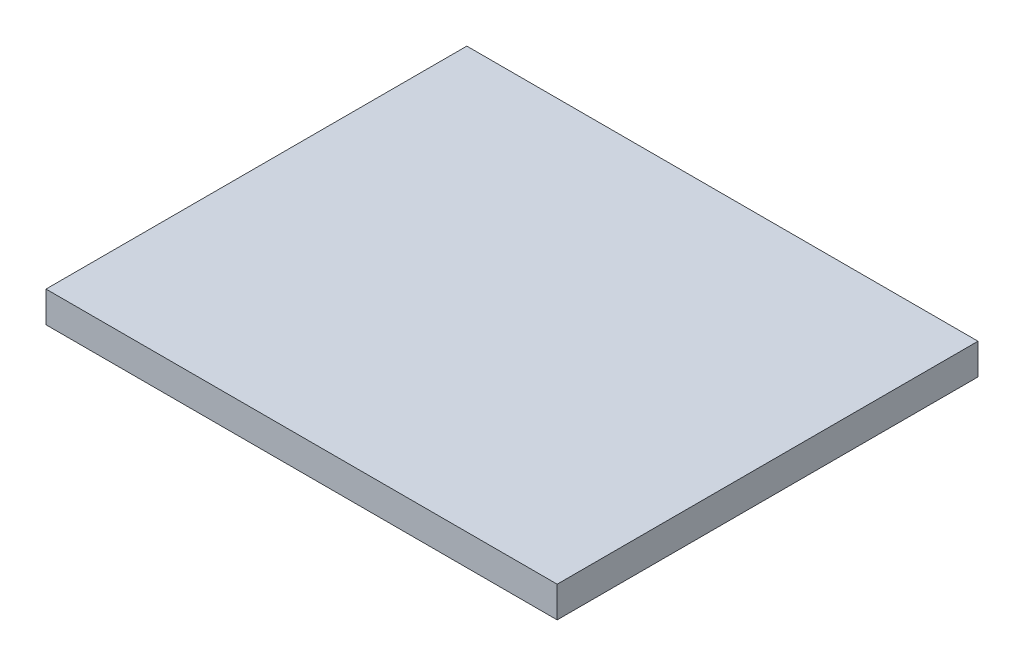
ISO-10303-21;
HEADER;
FILE_DESCRIPTION(('STEP AP214'),'2;1');
FILE_NAME('part.step','',(''),(''),'','','');
FILE_SCHEMA(('AUTOMOTIVE_DESIGN { 1 0 10303 214 1 1 1 1 }'));
ENDSEC;
DATA;
#1=APPLICATION_CONTEXT('core data for automotive mechanical design processes');
#2=APPLICATION_PROTOCOL_DEFINITION('international standard','automotive_design',2000,#1);
#3=PRODUCT_CONTEXT('',#1,'mechanical');
#4=PRODUCT('Part','Part','',(#3));
#5=PRODUCT_RELATED_PRODUCT_CATEGORY('part','',(#4));
#6=PRODUCT_DEFINITION_FORMATION('','',#4);
#7=PRODUCT_DEFINITION_CONTEXT('part definition',#1,'design');
#8=PRODUCT_DEFINITION('design','',#6,#7);
#9=PRODUCT_DEFINITION_SHAPE('','',#8);
#10=(LENGTH_UNIT() NAMED_UNIT(*) SI_UNIT(.MILLI.,.METRE.));
#11=(NAMED_UNIT(*) PLANE_ANGLE_UNIT() SI_UNIT($,.RADIAN.));
#12=(NAMED_UNIT(*) SI_UNIT($,.STERADIAN.) SOLID_ANGLE_UNIT());
#13=UNCERTAINTY_MEASURE_WITH_UNIT(LENGTH_MEASURE(1.E-05),#10,'distance_accuracy_value','');
#14=(GEOMETRIC_REPRESENTATION_CONTEXT(3) GLOBAL_UNCERTAINTY_ASSIGNED_CONTEXT((#13)) GLOBAL_UNIT_ASSIGNED_CONTEXT((#10,
#11,#12)) REPRESENTATION_CONTEXT('',''));
#15=CARTESIAN_POINT('',(0.,0.,0.));
#16=DIRECTION('',(0.,0.,1.));
#17=DIRECTION('',(1.,0.,0.));
#18=AXIS2_PLACEMENT_3D('',#15,#16,#17);
#19=CARTESIAN_POINT('',(206.5,25.,170.));
#20=DIRECTION('',(-1.,0.,0.));
#21=DIRECTION('',(0.,0.,1.));
#22=AXIS2_PLACEMENT_3D('',#19,#20,#21);
#23=PLANE('',#22);
#24=DIRECTION('',(0.,0.,-1.));
#25=VECTOR('',#24,1.);
#26=CARTESIAN_POINT('',(206.5,0.,170.));
#27=LINE('',#26,#25);
#28=CARTESIAN_POINT('',(206.5,0.,170.));
#29=VERTEX_POINT('',#28);
#30=CARTESIAN_POINT('',(206.5,0.,-170.));
#31=VERTEX_POINT('',#30);
#32=EDGE_CURVE('E97',#29,#31,#27,.T.);
#33=ORIENTED_EDGE('',*,*,#32,.T.);
#34=DIRECTION('',(0.,-1.,0.));
#35=VECTOR('',#34,1.);
#36=CARTESIAN_POINT('',(206.5,25.,-170.));
#37=LINE('',#36,#35);
#38=CARTESIAN_POINT('',(206.5,25.,-170.));
#39=VERTEX_POINT('',#38);
#40=EDGE_CURVE('E11',#39,#31,#37,.T.);
#41=ORIENTED_EDGE('',*,*,#40,.F.);
#42=DIRECTION('',(0.,0.,-1.));
#43=VECTOR('',#42,1.);
#44=CARTESIAN_POINT('',(206.5,25.,170.));
#45=LINE('',#44,#43);
#46=CARTESIAN_POINT('',(206.5,25.,170.));
#47=VERTEX_POINT('',#46);
#48=EDGE_CURVE('E85',#47,#39,#45,.T.);
#49=ORIENTED_EDGE('',*,*,#48,.F.);
#50=DIRECTION('',(0.,-1.,0.));
#51=VECTOR('',#50,1.);
#52=CARTESIAN_POINT('',(206.5,25.,170.));
#53=LINE('',#52,#51);
#54=EDGE_CURVE('E93',#47,#29,#53,.T.);
#55=ORIENTED_EDGE('',*,*,#54,.T.);
#56=EDGE_LOOP('',(#33,#41,#49,#55));
#57=FACE_BOUND('',#56,.T.);
#58=ADVANCED_FACE('F34',(#57),#23,.F.);
#59=CARTESIAN_POINT('',(-206.5,25.,-170.));
#60=DIRECTION('',(0.,0.,1.));
#61=DIRECTION('',(1.,0.,0.));
#62=AXIS2_PLACEMENT_3D('',#59,#60,#61);
#63=PLANE('',#62);
#64=DIRECTION('',(-1.,0.,0.));
#65=VECTOR('',#64,1.);
#66=CARTESIAN_POINT('',(-206.5,0.,-170.));
#67=LINE('',#66,#65);
#68=CARTESIAN_POINT('',(-206.5,0.,-170.));
#69=VERTEX_POINT('',#68);
#70=EDGE_CURVE('E89',#31,#69,#67,.T.);
#71=ORIENTED_EDGE('',*,*,#70,.T.);
#72=DIRECTION('',(0.,-1.,0.));
#73=VECTOR('',#72,1.);
#74=CARTESIAN_POINT('',(-206.5,25.,-170.));
#75=LINE('',#74,#73);
#76=CARTESIAN_POINT('',(-206.5,25.,-170.));
#77=VERTEX_POINT('',#76);
#78=EDGE_CURVE('E42',#77,#69,#75,.T.);
#79=ORIENTED_EDGE('',*,*,#78,.F.);
#80=DIRECTION('',(-1.,0.,0.));
#81=VECTOR('',#80,1.);
#82=CARTESIAN_POINT('',(-206.5,25.,-170.));
#83=LINE('',#82,#81);
#84=EDGE_CURVE('E80',#39,#77,#83,.T.);
#85=ORIENTED_EDGE('',*,*,#84,.F.);
#86=ORIENTED_EDGE('',*,*,#40,.T.);
#87=EDGE_LOOP('',(#71,#79,#85,#86));
#88=FACE_BOUND('',#87,.T.);
#89=ADVANCED_FACE('F88',(#88),#63,.F.);
#90=CARTESIAN_POINT('',(-206.5,25.,170.));
#91=DIRECTION('',(1.,0.,0.));
#92=DIRECTION('',(0.,0.,-1.));
#93=AXIS2_PLACEMENT_3D('',#90,#91,#92);
#94=PLANE('',#93);
#95=DIRECTION('',(0.,0.,1.));
#96=VECTOR('',#95,1.);
#97=CARTESIAN_POINT('',(-206.5,0.,170.));
#98=LINE('',#97,#96);
#99=CARTESIAN_POINT('',(-206.5,0.,170.));
#100=VERTEX_POINT('',#99);
#101=EDGE_CURVE('E67',#69,#100,#98,.T.);
#102=ORIENTED_EDGE('',*,*,#101,.T.);
#103=DIRECTION('',(0.,-1.,0.));
#104=VECTOR('',#103,1.);
#105=CARTESIAN_POINT('',(-206.5,25.,170.));
#106=LINE('',#105,#104);
#107=CARTESIAN_POINT('',(-206.5,25.,170.));
#108=VERTEX_POINT('',#107);
#109=EDGE_CURVE('E90',#108,#100,#106,.T.);
#110=ORIENTED_EDGE('',*,*,#109,.F.);
#111=DIRECTION('',(0.,0.,1.));
#112=VECTOR('',#111,1.);
#113=CARTESIAN_POINT('',(-206.5,25.,170.));
#114=LINE('',#113,#112);
#115=EDGE_CURVE('E83',#77,#108,#114,.T.);
#116=ORIENTED_EDGE('',*,*,#115,.F.);
#117=ORIENTED_EDGE('',*,*,#78,.T.);
#118=EDGE_LOOP('',(#102,#110,#116,#117));
#119=FACE_BOUND('',#118,.T.);
#120=ADVANCED_FACE('F91',(#119),#94,.F.);
#121=CARTESIAN_POINT('',(-206.5,25.,170.));
#122=DIRECTION('',(0.,0.,-1.));
#123=DIRECTION('',(-1.,0.,0.));
#124=AXIS2_PLACEMENT_3D('',#121,#122,#123);
#125=PLANE('',#124);
#126=DIRECTION('',(1.,0.,0.));
#127=VECTOR('',#126,1.);
#128=CARTESIAN_POINT('',(-206.5,0.,170.));
#129=LINE('',#128,#127);
#130=EDGE_CURVE('E73',#100,#29,#129,.T.);
#131=ORIENTED_EDGE('',*,*,#130,.T.);
#132=ORIENTED_EDGE('',*,*,#54,.F.);
#133=DIRECTION('',(1.,0.,0.));
#134=VECTOR('',#133,1.);
#135=CARTESIAN_POINT('',(-206.5,25.,170.));
#136=LINE('',#135,#134);
#137=EDGE_CURVE('E50',#108,#47,#136,.T.);
#138=ORIENTED_EDGE('',*,*,#137,.F.);
#139=ORIENTED_EDGE('',*,*,#109,.T.);
#140=EDGE_LOOP('',(#131,#132,#138,#139));
#141=FACE_BOUND('',#140,.T.);
#142=ADVANCED_FACE('F104',(#141),#125,.F.);
#143=CARTESIAN_POINT('',(0.,25.,0.));
#144=DIRECTION('',(0.,-1.,0.));
#145=DIRECTION('',(0.,0.,-1.));
#146=AXIS2_PLACEMENT_3D('',#143,#144,#145);
#147=PLANE('',#146);
#148=ORIENTED_EDGE('',*,*,#48,.T.);
#149=ORIENTED_EDGE('',*,*,#84,.T.);
#150=ORIENTED_EDGE('',*,*,#115,.T.);
#151=ORIENTED_EDGE('',*,*,#137,.T.);
#152=EDGE_LOOP('',(#148,#149,#150,#151));
#153=FACE_BOUND('',#152,.T.);
#154=ADVANCED_FACE('F81',(#153),#147,.F.);
#155=CARTESIAN_POINT('',(0.,0.,0.));
#156=DIRECTION('',(0.,-1.,0.));
#157=DIRECTION('',(0.,0.,-1.));
#158=AXIS2_PLACEMENT_3D('',#155,#156,#157);
#159=PLANE('',#158);
#160=ORIENTED_EDGE('',*,*,#32,.F.);
#161=ORIENTED_EDGE('',*,*,#130,.F.);
#162=ORIENTED_EDGE('',*,*,#101,.F.);
#163=ORIENTED_EDGE('',*,*,#70,.F.);
#164=EDGE_LOOP('',(#160,#161,#162,#163));
#165=FACE_BOUND('',#164,.T.);
#166=ADVANCED_FACE('F107',(#165),#159,.T.);
#167=CLOSED_SHELL('',(#58,#89,#120,#142,#154,#166));
#168=MANIFOLD_SOLID_BREP('B2',#167);
#169=ADVANCED_BREP_SHAPE_REPRESENTATION('',(#18,#168),#14);
#170=SHAPE_DEFINITION_REPRESENTATION(#9,#169);
ENDSEC;
END-ISO-10303-21;
